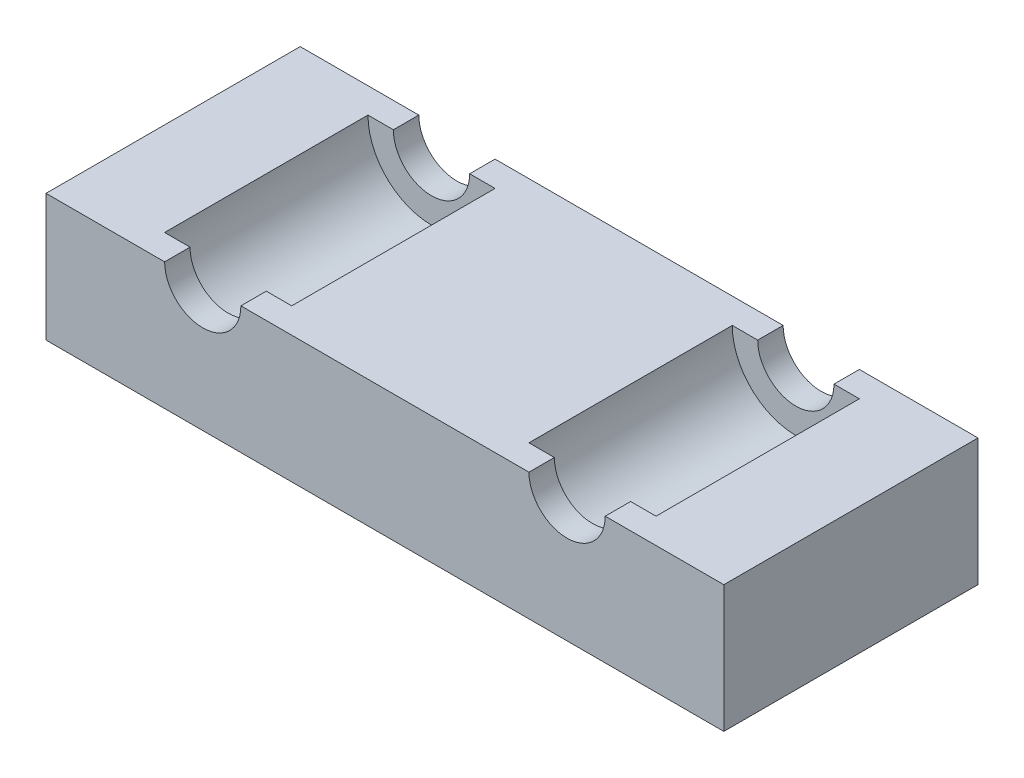
ISO-10303-21;
HEADER;
FILE_DESCRIPTION(('STEP AP214'),'2;1');
FILE_NAME('part.step','',(''),(''),'','','');
FILE_SCHEMA(('AUTOMOTIVE_DESIGN { 1 0 10303 214 1 1 1 1 }'));
ENDSEC;
DATA;
#1=APPLICATION_CONTEXT('core data for automotive mechanical design processes');
#2=APPLICATION_PROTOCOL_DEFINITION('international standard','automotive_design',2000,#1);
#3=PRODUCT_CONTEXT('',#1,'mechanical');
#4=PRODUCT('Part','Part','',(#3));
#5=PRODUCT_RELATED_PRODUCT_CATEGORY('part','',(#4));
#6=PRODUCT_DEFINITION_FORMATION('','',#4);
#7=PRODUCT_DEFINITION_CONTEXT('part definition',#1,'design');
#8=PRODUCT_DEFINITION('design','',#6,#7);
#9=PRODUCT_DEFINITION_SHAPE('','',#8);
#10=(LENGTH_UNIT() NAMED_UNIT(*) SI_UNIT(.MILLI.,.METRE.));
#11=(NAMED_UNIT(*) PLANE_ANGLE_UNIT() SI_UNIT($,.RADIAN.));
#12=(NAMED_UNIT(*) SI_UNIT($,.STERADIAN.) SOLID_ANGLE_UNIT());
#13=UNCERTAINTY_MEASURE_WITH_UNIT(LENGTH_MEASURE(1.E-05),#10,'distance_accuracy_value','');
#14=(GEOMETRIC_REPRESENTATION_CONTEXT(3) GLOBAL_UNCERTAINTY_ASSIGNED_CONTEXT((#13)) GLOBAL_UNIT_ASSIGNED_CONTEXT((#10,
#11,#12)) REPRESENTATION_CONTEXT('',''));
#15=CARTESIAN_POINT('',(0.,0.,0.));
#16=DIRECTION('',(0.,0.,1.));
#17=DIRECTION('',(1.,0.,0.));
#18=AXIS2_PLACEMENT_3D('',#15,#16,#17);
#19=CARTESIAN_POINT('',(0.,15.,0.));
#20=DIRECTION('',(0.,-1.,0.));
#21=DIRECTION('',(0.,0.,-1.));
#22=AXIS2_PLACEMENT_3D('',#19,#20,#21);
#23=PLANE('',#22);
#24=DIRECTION('',(-1.,0.,0.));
#25=VECTOR('',#24,1.);
#26=CARTESIAN_POINT('',(0.,15.,-30.));
#27=LINE('',#26,#25);
#28=CARTESIAN_POINT('',(57.,15.,-30.));
#29=VERTEX_POINT('',#28);
#30=CARTESIAN_POINT('',(23.,15.,-30.));
#31=VERTEX_POINT('',#30);
#32=EDGE_CURVE('E162',#29,#31,#27,.T.);
#33=ORIENTED_EDGE('',*,*,#32,.T.);
#34=DIRECTION('',(0.,0.,1.));
#35=VECTOR('',#34,1.);
#36=CARTESIAN_POINT('',(23.,15.,-30.));
#37=LINE('',#36,#35);
#38=CARTESIAN_POINT('',(23.,15.,-27.));
#39=VERTEX_POINT('',#38);
#40=EDGE_CURVE('E145',#31,#39,#37,.T.);
#41=ORIENTED_EDGE('',*,*,#40,.T.);
#42=DIRECTION('',(1.,0.,0.));
#43=VECTOR('',#42,1.);
#44=CARTESIAN_POINT('',(11.,15.,-27.));
#45=LINE('',#44,#43);
#46=CARTESIAN_POINT('',(26.,15.,-27.));
#47=VERTEX_POINT('',#46);
#48=EDGE_CURVE('E281',#39,#47,#45,.T.);
#49=ORIENTED_EDGE('',*,*,#48,.T.);
#50=DIRECTION('',(0.,0.,1.));
#51=VECTOR('',#50,1.);
#52=CARTESIAN_POINT('',(26.,15.,-30.));
#53=LINE('',#52,#51);
#54=CARTESIAN_POINT('',(26.,15.,-3.));
#55=VERTEX_POINT('',#54);
#56=EDGE_CURVE('E208',#47,#55,#53,.T.);
#57=ORIENTED_EDGE('',*,*,#56,.T.);
#58=DIRECTION('',(-1.,0.,0.));
#59=VECTOR('',#58,1.);
#60=CARTESIAN_POINT('',(11.,15.,-3.));
#61=LINE('',#60,#59);
#62=CARTESIAN_POINT('',(23.,15.,-3.));
#63=VERTEX_POINT('',#62);
#64=EDGE_CURVE('E182',#55,#63,#61,.T.);
#65=ORIENTED_EDGE('',*,*,#64,.T.);
#66=CARTESIAN_POINT('',(23.,15.,0.));
#67=VERTEX_POINT('',#66);
#68=EDGE_CURVE('E49',#63,#67,#37,.T.);
#69=ORIENTED_EDGE('',*,*,#68,.T.);
#70=DIRECTION('',(1.,0.,0.));
#71=VECTOR('',#70,1.);
#72=CARTESIAN_POINT('',(0.,15.,0.));
#73=LINE('',#72,#71);
#74=CARTESIAN_POINT('',(57.,15.,0.));
#75=VERTEX_POINT('',#74);
#76=EDGE_CURVE('E249',#67,#75,#73,.T.);
#77=ORIENTED_EDGE('',*,*,#76,.T.);
#78=DIRECTION('',(0.,0.,1.));
#79=VECTOR('',#78,1.);
#80=CARTESIAN_POINT('',(57.,15.,-30.));
#81=LINE('',#80,#79);
#82=CARTESIAN_POINT('',(57.,15.,-3.));
#83=VERTEX_POINT('',#82);
#84=EDGE_CURVE('E286',#75,#83,#81,.F.);
#85=ORIENTED_EDGE('',*,*,#84,.T.);
#86=DIRECTION('',(-1.,0.,0.));
#87=VECTOR('',#86,1.);
#88=CARTESIAN_POINT('',(54.,15.,-3.));
#89=LINE('',#88,#87);
#90=CARTESIAN_POINT('',(54.,15.,-3.));
#91=VERTEX_POINT('',#90);
#92=EDGE_CURVE('E280',#83,#91,#89,.T.);
#93=ORIENTED_EDGE('',*,*,#92,.T.);
#94=DIRECTION('',(0.,0.,1.));
#95=VECTOR('',#94,1.);
#96=CARTESIAN_POINT('',(54.,15.,-30.));
#97=LINE('',#96,#95);
#98=CARTESIAN_POINT('',(54.,15.,-27.));
#99=VERTEX_POINT('',#98);
#100=EDGE_CURVE('E200',#91,#99,#97,.F.);
#101=ORIENTED_EDGE('',*,*,#100,.T.);
#102=DIRECTION('',(1.,0.,0.));
#103=VECTOR('',#102,1.);
#104=CARTESIAN_POINT('',(54.,15.,-27.));
#105=LINE('',#104,#103);
#106=CARTESIAN_POINT('',(57.,15.,-27.));
#107=VERTEX_POINT('',#106);
#108=EDGE_CURVE('E279',#99,#107,#105,.T.);
#109=ORIENTED_EDGE('',*,*,#108,.T.);
#110=EDGE_CURVE('E169',#107,#29,#81,.F.);
#111=ORIENTED_EDGE('',*,*,#110,.T.);
#112=EDGE_LOOP('',(#33,#41,#49,#57,#65,#69,#77,#85,#93,#101,#109,#111));
#113=FACE_BOUND('',#112,.T.);
#114=ADVANCED_FACE('F34',(#113),#23,.F.);
#115=CARTESIAN_POINT('',(80.,15.,-30.));
#116=VERTEX_POINT('',#115);
#117=CARTESIAN_POINT('',(66.,15.,-30.));
#118=VERTEX_POINT('',#117);
#119=EDGE_CURVE('E170',#116,#118,#27,.T.);
#120=ORIENTED_EDGE('',*,*,#119,.T.);
#121=DIRECTION('',(0.,0.,1.));
#122=VECTOR('',#121,1.);
#123=CARTESIAN_POINT('',(66.,15.,-30.));
#124=LINE('',#123,#122);
#125=CARTESIAN_POINT('',(66.,15.,-27.));
#126=VERTEX_POINT('',#125);
#127=EDGE_CURVE('E268',#118,#126,#124,.T.);
#128=ORIENTED_EDGE('',*,*,#127,.T.);
#129=CARTESIAN_POINT('',(69.,15.,-27.));
#130=VERTEX_POINT('',#129);
#131=EDGE_CURVE('E270',#126,#130,#105,.T.);
#132=ORIENTED_EDGE('',*,*,#131,.T.);
#133=DIRECTION('',(0.,0.,1.));
#134=VECTOR('',#133,1.);
#135=CARTESIAN_POINT('',(69.,15.,-30.));
#136=LINE('',#135,#134);
#137=CARTESIAN_POINT('',(69.,15.,-3.));
#138=VERTEX_POINT('',#137);
#139=EDGE_CURVE('E203',#130,#138,#136,.T.);
#140=ORIENTED_EDGE('',*,*,#139,.T.);
#141=CARTESIAN_POINT('',(66.,15.,-3.));
#142=VERTEX_POINT('',#141);
#143=EDGE_CURVE('E238',#138,#142,#89,.T.);
#144=ORIENTED_EDGE('',*,*,#143,.T.);
#145=CARTESIAN_POINT('',(66.,15.,0.));
#146=VERTEX_POINT('',#145);
#147=EDGE_CURVE('E57',#142,#146,#124,.T.);
#148=ORIENTED_EDGE('',*,*,#147,.T.);
#149=CARTESIAN_POINT('',(80.,15.,0.));
#150=VERTEX_POINT('',#149);
#151=EDGE_CURVE('E247',#146,#150,#73,.T.);
#152=ORIENTED_EDGE('',*,*,#151,.T.);
#153=DIRECTION('',(0.,0.,-1.));
#154=VECTOR('',#153,1.);
#155=CARTESIAN_POINT('',(80.,15.,0.));
#156=LINE('',#155,#154);
#157=EDGE_CURVE('E174',#150,#116,#156,.T.);
#158=ORIENTED_EDGE('',*,*,#157,.T.);
#159=EDGE_LOOP('',(#120,#128,#132,#140,#144,#148,#152,#158));
#160=FACE_BOUND('',#159,.T.);
#161=ADVANCED_FACE('F254',(#160),#23,.F.);
#162=CARTESIAN_POINT('',(0.,15.,0.));
#163=DIRECTION('',(1.,0.,0.));
#164=DIRECTION('',(0.,0.,-1.));
#165=AXIS2_PLACEMENT_3D('',#162,#163,#164);
#166=PLANE('',#165);
#167=DIRECTION('',(0.,0.,1.));
#168=VECTOR('',#167,1.);
#169=CARTESIAN_POINT('',(0.,0.,0.));
#170=LINE('',#169,#168);
#171=CARTESIAN_POINT('',(0.,0.,-30.));
#172=VERTEX_POINT('',#171);
#173=CARTESIAN_POINT('',(0.,0.,0.));
#174=VERTEX_POINT('',#173);
#175=EDGE_CURVE('E178',#172,#174,#170,.T.);
#176=ORIENTED_EDGE('',*,*,#175,.T.);
#177=DIRECTION('',(0.,-1.,0.));
#178=VECTOR('',#177,1.);
#179=CARTESIAN_POINT('',(0.,15.,0.));
#180=LINE('',#179,#178);
#181=CARTESIAN_POINT('',(0.,15.,0.));
#182=VERTEX_POINT('',#181);
#183=EDGE_CURVE('E197',#182,#174,#180,.T.);
#184=ORIENTED_EDGE('',*,*,#183,.F.);
#185=DIRECTION('',(0.,0.,1.));
#186=VECTOR('',#185,1.);
#187=CARTESIAN_POINT('',(0.,15.,0.));
#188=LINE('',#187,#186);
#189=CARTESIAN_POINT('',(0.,15.,-30.));
#190=VERTEX_POINT('',#189);
#191=EDGE_CURVE('E188',#190,#182,#188,.T.);
#192=ORIENTED_EDGE('',*,*,#191,.F.);
#193=DIRECTION('',(0.,-1.,0.));
#194=VECTOR('',#193,1.);
#195=CARTESIAN_POINT('',(0.,15.,-30.));
#196=LINE('',#195,#194);
#197=EDGE_CURVE('E173',#190,#172,#196,.T.);
#198=ORIENTED_EDGE('',*,*,#197,.T.);
#199=EDGE_LOOP('',(#176,#184,#192,#198));
#200=FACE_BOUND('',#199,.T.);
#201=ADVANCED_FACE('F36',(#200),#166,.F.);
#202=CARTESIAN_POINT('',(0.,15.,0.));
#203=DIRECTION('',(0.,0.,-1.));
#204=DIRECTION('',(-1.,0.,0.));
#205=AXIS2_PLACEMENT_3D('',#202,#203,#204);
#206=PLANE('',#205);
#207=ORIENTED_EDGE('',*,*,#76,.F.);
#208=CARTESIAN_POINT('',(18.5,15.,0.));
#209=DIRECTION('',(0.,0.,-1.));
#210=DIRECTION('',(-1.,0.,0.));
#211=AXIS2_PLACEMENT_3D('',#208,#209,#210);
#212=CIRCLE('',#211,4.5);
#213=CARTESIAN_POINT('',(14.,15.,0.));
#214=VERTEX_POINT('',#213);
#215=EDGE_CURVE('E289',#67,#214,#212,.T.);
#216=ORIENTED_EDGE('',*,*,#215,.T.);
#217=EDGE_CURVE('E248',#182,#214,#73,.T.);
#218=ORIENTED_EDGE('',*,*,#217,.F.);
#219=ORIENTED_EDGE('',*,*,#183,.T.);
#220=DIRECTION('',(1.,0.,0.));
#221=VECTOR('',#220,1.);
#222=CARTESIAN_POINT('',(0.,0.,0.));
#223=LINE('',#222,#221);
#224=CARTESIAN_POINT('',(80.,0.,0.));
#225=VERTEX_POINT('',#224);
#226=EDGE_CURVE('E181',#174,#225,#223,.T.);
#227=ORIENTED_EDGE('',*,*,#226,.T.);
#228=DIRECTION('',(0.,-1.,0.));
#229=VECTOR('',#228,1.);
#230=CARTESIAN_POINT('',(80.,15.,0.));
#231=LINE('',#230,#229);
#232=EDGE_CURVE('E194',#150,#225,#231,.T.);
#233=ORIENTED_EDGE('',*,*,#232,.F.);
#234=ORIENTED_EDGE('',*,*,#151,.F.);
#235=CARTESIAN_POINT('',(61.5,15.,0.));
#236=DIRECTION('',(0.,0.,-1.));
#237=DIRECTION('',(-1.,0.,0.));
#238=AXIS2_PLACEMENT_3D('',#235,#236,#237);
#239=CIRCLE('',#238,4.5);
#240=EDGE_CURVE('E284',#146,#75,#239,.T.);
#241=ORIENTED_EDGE('',*,*,#240,.T.);
#242=EDGE_LOOP('',(#207,#216,#218,#219,#227,#233,#234,#241));
#243=FACE_BOUND('',#242,.T.);
#244=ADVANCED_FACE('F261',(#243),#206,.F.);
#245=CARTESIAN_POINT('',(80.,15.,0.));
#246=DIRECTION('',(-1.,0.,0.));
#247=DIRECTION('',(0.,0.,1.));
#248=AXIS2_PLACEMENT_3D('',#245,#246,#247);
#249=PLANE('',#248);
#250=DIRECTION('',(0.,0.,-1.));
#251=VECTOR('',#250,1.);
#252=CARTESIAN_POINT('',(80.,0.,0.));
#253=LINE('',#252,#251);
#254=CARTESIAN_POINT('',(80.,0.,-30.));
#255=VERTEX_POINT('',#254);
#256=EDGE_CURVE('E184',#225,#255,#253,.T.);
#257=ORIENTED_EDGE('',*,*,#256,.T.);
#258=DIRECTION('',(0.,-1.,0.));
#259=VECTOR('',#258,1.);
#260=CARTESIAN_POINT('',(80.,15.,-30.));
#261=LINE('',#260,#259);
#262=EDGE_CURVE('E191',#116,#255,#261,.T.);
#263=ORIENTED_EDGE('',*,*,#262,.F.);
#264=ORIENTED_EDGE('',*,*,#157,.F.);
#265=ORIENTED_EDGE('',*,*,#232,.T.);
#266=EDGE_LOOP('',(#257,#263,#264,#265));
#267=FACE_BOUND('',#266,.T.);
#268=ADVANCED_FACE('F264',(#267),#249,.F.);
#269=CARTESIAN_POINT('',(0.,15.,-30.));
#270=DIRECTION('',(0.,0.,1.));
#271=DIRECTION('',(1.,0.,0.));
#272=AXIS2_PLACEMENT_3D('',#269,#270,#271);
#273=PLANE('',#272);
#274=CARTESIAN_POINT('',(14.,15.,-30.));
#275=VERTEX_POINT('',#274);
#276=EDGE_CURVE('E164',#275,#190,#27,.T.);
#277=ORIENTED_EDGE('',*,*,#276,.F.);
#278=CARTESIAN_POINT('',(18.5,15.,-30.));
#279=DIRECTION('',(0.,0.,1.));
#280=DIRECTION('',(1.,0.,0.));
#281=AXIS2_PLACEMENT_3D('',#278,#279,#280);
#282=CIRCLE('',#281,4.5);
#283=EDGE_CURVE('E148',#275,#31,#282,.T.);
#284=ORIENTED_EDGE('',*,*,#283,.T.);
#285=ORIENTED_EDGE('',*,*,#32,.F.);
#286=CARTESIAN_POINT('',(61.5,15.,-30.));
#287=DIRECTION('',(0.,0.,1.));
#288=DIRECTION('',(1.,0.,0.));
#289=AXIS2_PLACEMENT_3D('',#286,#287,#288);
#290=CIRCLE('',#289,4.5);
#291=EDGE_CURVE('E165',#29,#118,#290,.T.);
#292=ORIENTED_EDGE('',*,*,#291,.T.);
#293=ORIENTED_EDGE('',*,*,#119,.F.);
#294=ORIENTED_EDGE('',*,*,#262,.T.);
#295=DIRECTION('',(-1.,0.,0.));
#296=VECTOR('',#295,1.);
#297=CARTESIAN_POINT('',(0.,0.,-30.));
#298=LINE('',#297,#296);
#299=EDGE_CURVE('E186',#255,#172,#298,.T.);
#300=ORIENTED_EDGE('',*,*,#299,.T.);
#301=ORIENTED_EDGE('',*,*,#197,.F.);
#302=EDGE_LOOP('',(#277,#284,#285,#292,#293,#294,#300,#301));
#303=FACE_BOUND('',#302,.T.);
#304=ADVANCED_FACE('F160',(#303),#273,.F.);
#305=ORIENTED_EDGE('',*,*,#217,.T.);
#306=DIRECTION('',(0.,0.,1.));
#307=VECTOR('',#306,1.);
#308=CARTESIAN_POINT('',(14.,15.,-30.));
#309=LINE('',#308,#307);
#310=CARTESIAN_POINT('',(14.,15.,-3.));
#311=VERTEX_POINT('',#310);
#312=EDGE_CURVE('E236',#214,#311,#309,.F.);
#313=ORIENTED_EDGE('',*,*,#312,.T.);
#314=CARTESIAN_POINT('',(11.,15.,-3.));
#315=VERTEX_POINT('',#314);
#316=EDGE_CURVE('E234',#311,#315,#61,.T.);
#317=ORIENTED_EDGE('',*,*,#316,.T.);
#318=DIRECTION('',(0.,0.,1.));
#319=VECTOR('',#318,1.);
#320=CARTESIAN_POINT('',(11.,15.,-30.));
#321=LINE('',#320,#319);
#322=CARTESIAN_POINT('',(11.,15.,-27.));
#323=VERTEX_POINT('',#322);
#324=EDGE_CURVE('E205',#315,#323,#321,.F.);
#325=ORIENTED_EDGE('',*,*,#324,.T.);
#326=CARTESIAN_POINT('',(14.,15.,-27.));
#327=VERTEX_POINT('',#326);
#328=EDGE_CURVE('E231',#323,#327,#45,.T.);
#329=ORIENTED_EDGE('',*,*,#328,.T.);
#330=EDGE_CURVE('E155',#327,#275,#309,.F.);
#331=ORIENTED_EDGE('',*,*,#330,.T.);
#332=ORIENTED_EDGE('',*,*,#276,.T.);
#333=ORIENTED_EDGE('',*,*,#191,.T.);
#334=EDGE_LOOP('',(#305,#313,#317,#325,#329,#331,#332,#333));
#335=FACE_BOUND('',#334,.T.);
#336=ADVANCED_FACE('F230',(#335),#23,.F.);
#337=CARTESIAN_POINT('',(0.,0.,0.));
#338=DIRECTION('',(0.,-1.,0.));
#339=DIRECTION('',(0.,0.,-1.));
#340=AXIS2_PLACEMENT_3D('',#337,#338,#339);
#341=PLANE('',#340);
#342=ORIENTED_EDGE('',*,*,#175,.F.);
#343=ORIENTED_EDGE('',*,*,#299,.F.);
#344=ORIENTED_EDGE('',*,*,#256,.F.);
#345=ORIENTED_EDGE('',*,*,#226,.F.);
#346=EDGE_LOOP('',(#342,#343,#344,#345));
#347=FACE_BOUND('',#346,.T.);
#348=ADVANCED_FACE('F305',(#347),#341,.T.);
#349=CARTESIAN_POINT('',(61.5,15.,-30.));
#350=DIRECTION('',(0.,0.,1.));
#351=DIRECTION('',(1.,0.,0.));
#352=AXIS2_PLACEMENT_3D('',#349,#350,#351);
#353=CYLINDRICAL_SURFACE('',#352,7.50000000000001);
#354=ORIENTED_EDGE('',*,*,#139,.F.);
#355=CARTESIAN_POINT('',(61.5,15.,-27.));
#356=DIRECTION('',(0.,0.,1.));
#357=DIRECTION('',(1.,0.,0.));
#358=AXIS2_PLACEMENT_3D('',#355,#356,#357);
#359=CIRCLE('',#358,7.50000000000001);
#360=EDGE_CURVE('E216',#130,#99,#359,.F.);
#361=ORIENTED_EDGE('',*,*,#360,.T.);
#362=ORIENTED_EDGE('',*,*,#100,.F.);
#363=CARTESIAN_POINT('',(61.5,15.,-3.));
#364=DIRECTION('',(0.,0.,-1.));
#365=DIRECTION('',(-1.,0.,0.));
#366=AXIS2_PLACEMENT_3D('',#363,#364,#365);
#367=CIRCLE('',#366,7.50000000000001);
#368=EDGE_CURVE('E213',#91,#138,#367,.F.);
#369=ORIENTED_EDGE('',*,*,#368,.T.);
#370=EDGE_LOOP('',(#354,#361,#362,#369));
#371=FACE_BOUND('',#370,.T.);
#372=ADVANCED_FACE('F303',(#371),#353,.F.);
#373=CARTESIAN_POINT('',(18.5,15.,-30.));
#374=DIRECTION('',(0.,0.,1.));
#375=DIRECTION('',(1.,0.,0.));
#376=AXIS2_PLACEMENT_3D('',#373,#374,#375);
#377=CYLINDRICAL_SURFACE('',#376,7.5);
#378=ORIENTED_EDGE('',*,*,#56,.F.);
#379=CARTESIAN_POINT('',(18.5,15.,-27.));
#380=DIRECTION('',(0.,0.,1.));
#381=DIRECTION('',(1.,0.,0.));
#382=AXIS2_PLACEMENT_3D('',#379,#380,#381);
#383=CIRCLE('',#382,7.5);
#384=EDGE_CURVE('E219',#47,#323,#383,.F.);
#385=ORIENTED_EDGE('',*,*,#384,.T.);
#386=ORIENTED_EDGE('',*,*,#324,.F.);
#387=CARTESIAN_POINT('',(18.5,15.,-3.));
#388=DIRECTION('',(0.,0.,-1.));
#389=DIRECTION('',(-1.,0.,0.));
#390=AXIS2_PLACEMENT_3D('',#387,#388,#389);
#391=CIRCLE('',#390,7.5);
#392=EDGE_CURVE('E210',#315,#55,#391,.F.);
#393=ORIENTED_EDGE('',*,*,#392,.T.);
#394=EDGE_LOOP('',(#378,#385,#386,#393));
#395=FACE_BOUND('',#394,.T.);
#396=ADVANCED_FACE('F225',(#395),#377,.F.);
#397=CARTESIAN_POINT('',(11.,5.,-3.));
#398=DIRECTION('',(0.,0.,-1.));
#399=DIRECTION('',(-1.,0.,0.));
#400=AXIS2_PLACEMENT_3D('',#397,#398,#399);
#401=PLANE('',#400);
#402=CARTESIAN_POINT('',(18.5,15.,-3.));
#403=DIRECTION('',(0.,0.,-1.));
#404=DIRECTION('',(-1.,0.,0.));
#405=AXIS2_PLACEMENT_3D('',#402,#403,#404);
#406=CIRCLE('',#405,4.5);
#407=EDGE_CURVE('E154',#63,#311,#406,.T.);
#408=ORIENTED_EDGE('',*,*,#407,.F.);
#409=ORIENTED_EDGE('',*,*,#64,.F.);
#410=ORIENTED_EDGE('',*,*,#392,.F.);
#411=ORIENTED_EDGE('',*,*,#316,.F.);
#412=EDGE_LOOP('',(#408,#409,#410,#411));
#413=FACE_BOUND('',#412,.T.);
#414=ADVANCED_FACE('F241',(#413),#401,.T.);
#415=CARTESIAN_POINT('',(54.,5.,-3.));
#416=DIRECTION('',(0.,0.,-1.));
#417=DIRECTION('',(-1.,0.,0.));
#418=AXIS2_PLACEMENT_3D('',#415,#416,#417);
#419=PLANE('',#418);
#420=CARTESIAN_POINT('',(61.5,15.,-3.));
#421=DIRECTION('',(0.,0.,-1.));
#422=DIRECTION('',(-1.,0.,0.));
#423=AXIS2_PLACEMENT_3D('',#420,#421,#422);
#424=CIRCLE('',#423,4.5);
#425=EDGE_CURVE('E273',#142,#83,#424,.T.);
#426=ORIENTED_EDGE('',*,*,#425,.F.);
#427=ORIENTED_EDGE('',*,*,#143,.F.);
#428=ORIENTED_EDGE('',*,*,#368,.F.);
#429=ORIENTED_EDGE('',*,*,#92,.F.);
#430=EDGE_LOOP('',(#426,#427,#428,#429));
#431=FACE_BOUND('',#430,.T.);
#432=ADVANCED_FACE('F299',(#431),#419,.T.);
#433=CARTESIAN_POINT('',(54.,5.,-27.));
#434=DIRECTION('',(0.,0.,1.));
#435=DIRECTION('',(1.,0.,0.));
#436=AXIS2_PLACEMENT_3D('',#433,#434,#435);
#437=PLANE('',#436);
#438=CARTESIAN_POINT('',(61.5,15.,-27.));
#439=DIRECTION('',(0.,0.,1.));
#440=DIRECTION('',(1.,0.,0.));
#441=AXIS2_PLACEMENT_3D('',#438,#439,#440);
#442=CIRCLE('',#441,4.5);
#443=EDGE_CURVE('E11',#107,#126,#442,.T.);
#444=ORIENTED_EDGE('',*,*,#443,.F.);
#445=ORIENTED_EDGE('',*,*,#108,.F.);
#446=ORIENTED_EDGE('',*,*,#360,.F.);
#447=ORIENTED_EDGE('',*,*,#131,.F.);
#448=EDGE_LOOP('',(#444,#445,#446,#447));
#449=FACE_BOUND('',#448,.T.);
#450=ADVANCED_FACE('F277',(#449),#437,.T.);
#451=CARTESIAN_POINT('',(11.,5.,-27.));
#452=DIRECTION('',(0.,0.,1.));
#453=DIRECTION('',(1.,0.,0.));
#454=AXIS2_PLACEMENT_3D('',#451,#452,#453);
#455=PLANE('',#454);
#456=CARTESIAN_POINT('',(18.5,15.,-27.));
#457=DIRECTION('',(0.,0.,1.));
#458=DIRECTION('',(1.,0.,0.));
#459=AXIS2_PLACEMENT_3D('',#456,#457,#458);
#460=CIRCLE('',#459,4.5);
#461=EDGE_CURVE('E42',#327,#39,#460,.T.);
#462=ORIENTED_EDGE('',*,*,#461,.F.);
#463=ORIENTED_EDGE('',*,*,#328,.F.);
#464=ORIENTED_EDGE('',*,*,#384,.F.);
#465=ORIENTED_EDGE('',*,*,#48,.F.);
#466=EDGE_LOOP('',(#462,#463,#464,#465));
#467=FACE_BOUND('',#466,.T.);
#468=ADVANCED_FACE('F398',(#467),#455,.T.);
#469=CARTESIAN_POINT('',(18.5,15.,-30.));
#470=DIRECTION('',(0.,0.,1.));
#471=DIRECTION('',(1.,0.,0.));
#472=AXIS2_PLACEMENT_3D('',#469,#470,#471);
#473=CYLINDRICAL_SURFACE('',#472,4.5);
#474=ORIENTED_EDGE('',*,*,#283,.F.);
#475=ORIENTED_EDGE('',*,*,#330,.F.);
#476=ORIENTED_EDGE('',*,*,#461,.T.);
#477=ORIENTED_EDGE('',*,*,#40,.F.);
#478=EDGE_LOOP('',(#474,#475,#476,#477));
#479=FACE_BOUND('',#478,.T.);
#480=ADVANCED_FACE('F147',(#479),#473,.F.);
#481=CARTESIAN_POINT('',(61.5,15.,-30.));
#482=DIRECTION('',(0.,0.,1.));
#483=DIRECTION('',(1.,0.,0.));
#484=AXIS2_PLACEMENT_3D('',#481,#482,#483);
#485=CYLINDRICAL_SURFACE('',#484,4.5);
#486=ORIENTED_EDGE('',*,*,#291,.F.);
#487=ORIENTED_EDGE('',*,*,#110,.F.);
#488=ORIENTED_EDGE('',*,*,#443,.T.);
#489=ORIENTED_EDGE('',*,*,#127,.F.);
#490=EDGE_LOOP('',(#486,#487,#488,#489));
#491=FACE_BOUND('',#490,.T.);
#492=ADVANCED_FACE('F427',(#491),#485,.F.);
#493=ORIENTED_EDGE('',*,*,#147,.F.);
#494=ORIENTED_EDGE('',*,*,#425,.T.);
#495=ORIENTED_EDGE('',*,*,#84,.F.);
#496=ORIENTED_EDGE('',*,*,#240,.F.);
#497=EDGE_LOOP('',(#493,#494,#495,#496));
#498=FACE_BOUND('',#497,.T.);
#499=ADVANCED_FACE('F295',(#498),#485,.F.);
#500=ORIENTED_EDGE('',*,*,#68,.F.);
#501=ORIENTED_EDGE('',*,*,#407,.T.);
#502=ORIENTED_EDGE('',*,*,#312,.F.);
#503=ORIENTED_EDGE('',*,*,#215,.F.);
#504=EDGE_LOOP('',(#500,#501,#502,#503));
#505=FACE_BOUND('',#504,.T.);
#506=ADVANCED_FACE('F429',(#505),#473,.F.);
#507=CLOSED_SHELL('',(#114,#161,#201,#244,#268,#304,#336,#348,#372,#396,#414,#432,#450,#468,
#480,#492,#499,#506));
#508=MANIFOLD_SOLID_BREP('B2',#507);
#509=ADVANCED_BREP_SHAPE_REPRESENTATION('',(#18,#508),#14);
#510=SHAPE_DEFINITION_REPRESENTATION(#9,#509);
ENDSEC;
END-ISO-10303-21;
